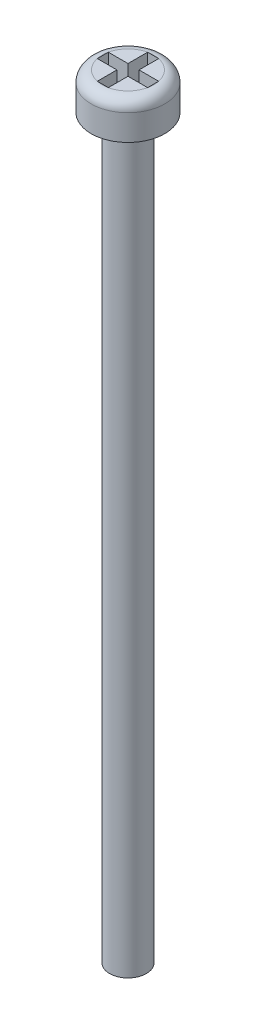
ISO-10303-21;
HEADER;
FILE_DESCRIPTION(('STEP AP214'),'2;1');
FILE_NAME('part.step','',(''),(''),'','','');
FILE_SCHEMA(('AUTOMOTIVE_DESIGN { 1 0 10303 214 1 1 1 1 }'));
ENDSEC;
DATA;
#1=APPLICATION_CONTEXT('core data for automotive mechanical design processes');
#2=APPLICATION_PROTOCOL_DEFINITION('international standard','automotive_design',2000,#1);
#3=PRODUCT_CONTEXT('',#1,'mechanical');
#4=PRODUCT('Part','Part','',(#3));
#5=PRODUCT_RELATED_PRODUCT_CATEGORY('part','',(#4));
#6=PRODUCT_DEFINITION_FORMATION('','',#4);
#7=PRODUCT_DEFINITION_CONTEXT('part definition',#1,'design');
#8=PRODUCT_DEFINITION('design','',#6,#7);
#9=PRODUCT_DEFINITION_SHAPE('','',#8);
#10=(LENGTH_UNIT() NAMED_UNIT(*) SI_UNIT(.MILLI.,.METRE.));
#11=(NAMED_UNIT(*) PLANE_ANGLE_UNIT() SI_UNIT($,.RADIAN.));
#12=(NAMED_UNIT(*) SI_UNIT($,.STERADIAN.) SOLID_ANGLE_UNIT());
#13=UNCERTAINTY_MEASURE_WITH_UNIT(LENGTH_MEASURE(1.E-05),#10,'distance_accuracy_value','');
#14=(GEOMETRIC_REPRESENTATION_CONTEXT(3) GLOBAL_UNCERTAINTY_ASSIGNED_CONTEXT((#13)) GLOBAL_UNIT_ASSIGNED_CONTEXT((#10,
#11,#12)) REPRESENTATION_CONTEXT('',''));
#15=CARTESIAN_POINT('',(0.,0.,0.));
#16=DIRECTION('',(0.,0.,1.));
#17=DIRECTION('',(1.,0.,0.));
#18=AXIS2_PLACEMENT_3D('',#15,#16,#17);
#19=CARTESIAN_POINT('',(0.,10.,0.));
#20=DIRECTION('',(0.,1.,0.));
#21=DIRECTION('',(0.,0.,1.));
#22=AXIS2_PLACEMENT_3D('',#19,#20,#21);
#23=PLANE('',#22);
#24=DIRECTION('',(-1.,0.,0.));
#25=VECTOR('',#24,1.);
#26=CARTESIAN_POINT('',(0.15,10.,-0.15));
#27=LINE('',#26,#25);
#28=CARTESIAN_POINT('',(0.683739716558867,10.,-0.15));
#29=VERTEX_POINT('',#28);
#30=CARTESIAN_POINT('',(0.15,10.,-0.15));
#31=VERTEX_POINT('',#30);
#32=EDGE_CURVE('E47',#29,#31,#27,.T.);
#33=ORIENTED_EDGE('',*,*,#32,.F.);
#34=CARTESIAN_POINT('',(0.,10.,0.));
#35=DIRECTION('',(0.,1.,0.));
#36=DIRECTION('',(0.,0.,1.));
#37=AXIS2_PLACEMENT_3D('',#34,#35,#36);
#38=CIRCLE('',#37,0.7);
#39=CARTESIAN_POINT('',(0.15,10.,-0.683739716558867));
#40=VERTEX_POINT('',#39);
#41=EDGE_CURVE('E219',#29,#40,#38,.T.);
#42=ORIENTED_EDGE('',*,*,#41,.T.);
#43=DIRECTION('',(0.,0.,-1.));
#44=VECTOR('',#43,1.);
#45=CARTESIAN_POINT('',(0.15,10.,-0.15));
#46=LINE('',#45,#44);
#47=EDGE_CURVE('E157',#31,#40,#46,.T.);
#48=ORIENTED_EDGE('',*,*,#47,.F.);
#49=EDGE_LOOP('',(#33,#42,#48));
#50=FACE_BOUND('',#49,.T.);
#51=ADVANCED_FACE('F32',(#50),#23,.T.);
#52=DIRECTION('',(0.,0.,-1.));
#53=VECTOR('',#52,1.);
#54=CARTESIAN_POINT('',(0.683739716558867,10.,0.15));
#55=LINE('',#54,#53);
#56=CARTESIAN_POINT('',(0.683739716558867,10.,0.15));
#57=VERTEX_POINT('',#56);
#58=EDGE_CURVE('E184',#57,#29,#55,.T.);
#59=ORIENTED_EDGE('',*,*,#58,.F.);
#60=EDGE_CURVE('E215',#57,#29,#38,.T.);
#61=ORIENTED_EDGE('',*,*,#60,.T.);
#62=EDGE_LOOP('',(#59,#61));
#63=FACE_BOUND('',#62,.T.);
#64=ADVANCED_FACE('F254',(#63),#23,.T.);
#65=DIRECTION('',(1.,0.,0.));
#66=VECTOR('',#65,1.);
#67=CARTESIAN_POINT('',(0.15,10.,0.15));
#68=LINE('',#67,#66);
#69=CARTESIAN_POINT('',(0.15,10.,0.15));
#70=VERTEX_POINT('',#69);
#71=EDGE_CURVE('E182',#70,#57,#68,.T.);
#72=ORIENTED_EDGE('',*,*,#71,.F.);
#73=DIRECTION('',(0.,0.,-1.));
#74=VECTOR('',#73,1.);
#75=CARTESIAN_POINT('',(0.15,10.,0.683739716558867));
#76=LINE('',#75,#74);
#77=CARTESIAN_POINT('',(0.15,10.,0.683739716558867));
#78=VERTEX_POINT('',#77);
#79=EDGE_CURVE('E131',#78,#70,#76,.T.);
#80=ORIENTED_EDGE('',*,*,#79,.F.);
#81=EDGE_CURVE('E40',#78,#57,#38,.T.);
#82=ORIENTED_EDGE('',*,*,#81,.T.);
#83=EDGE_LOOP('',(#72,#80,#82));
#84=FACE_BOUND('',#83,.T.);
#85=ADVANCED_FACE('F256',(#84),#23,.T.);
#86=DIRECTION('',(1.,0.,0.));
#87=VECTOR('',#86,1.);
#88=CARTESIAN_POINT('',(-0.15,10.,0.683739716558867));
#89=LINE('',#88,#87);
#90=CARTESIAN_POINT('',(-0.15,10.,0.683739716558867));
#91=VERTEX_POINT('',#90);
#92=EDGE_CURVE('E178',#91,#78,#89,.T.);
#93=ORIENTED_EDGE('',*,*,#92,.F.);
#94=EDGE_CURVE('E212',#91,#78,#38,.T.);
#95=ORIENTED_EDGE('',*,*,#94,.T.);
#96=EDGE_LOOP('',(#93,#95));
#97=FACE_BOUND('',#96,.T.);
#98=ADVANCED_FACE('F258',(#97),#23,.T.);
#99=DIRECTION('',(0.,0.,1.));
#100=VECTOR('',#99,1.);
#101=CARTESIAN_POINT('',(-0.15,10.,0.683739716558867));
#102=LINE('',#101,#100);
#103=CARTESIAN_POINT('',(-0.15,10.,0.15));
#104=VERTEX_POINT('',#103);
#105=EDGE_CURVE('E175',#104,#91,#102,.T.);
#106=ORIENTED_EDGE('',*,*,#105,.F.);
#107=DIRECTION('',(1.,0.,0.));
#108=VECTOR('',#107,1.);
#109=CARTESIAN_POINT('',(-0.683739716558867,10.,0.15));
#110=LINE('',#109,#108);
#111=CARTESIAN_POINT('',(-0.683739716558867,10.,0.15));
#112=VERTEX_POINT('',#111);
#113=EDGE_CURVE('E172',#112,#104,#110,.T.);
#114=ORIENTED_EDGE('',*,*,#113,.F.);
#115=EDGE_CURVE('E221',#112,#91,#38,.T.);
#116=ORIENTED_EDGE('',*,*,#115,.T.);
#117=EDGE_LOOP('',(#106,#114,#116));
#118=FACE_BOUND('',#117,.T.);
#119=ADVANCED_FACE('F264',(#118),#23,.T.);
#120=DIRECTION('',(0.,0.,1.));
#121=VECTOR('',#120,1.);
#122=CARTESIAN_POINT('',(-0.683739716558867,10.,0.15));
#123=LINE('',#122,#121);
#124=CARTESIAN_POINT('',(-0.683739716558867,10.,-0.15));
#125=VERTEX_POINT('',#124);
#126=EDGE_CURVE('E169',#125,#112,#123,.T.);
#127=ORIENTED_EDGE('',*,*,#126,.F.);
#128=EDGE_CURVE('E226',#125,#112,#38,.T.);
#129=ORIENTED_EDGE('',*,*,#128,.T.);
#130=EDGE_LOOP('',(#127,#129));
#131=FACE_BOUND('',#130,.T.);
#132=ADVANCED_FACE('F285',(#131),#23,.T.);
#133=DIRECTION('',(-1.,0.,0.));
#134=VECTOR('',#133,1.);
#135=CARTESIAN_POINT('',(-0.683739716558867,10.,-0.15));
#136=LINE('',#135,#134);
#137=CARTESIAN_POINT('',(-0.15,10.,-0.15));
#138=VERTEX_POINT('',#137);
#139=EDGE_CURVE('E166',#138,#125,#136,.T.);
#140=ORIENTED_EDGE('',*,*,#139,.F.);
#141=DIRECTION('',(0.,0.,1.));
#142=VECTOR('',#141,1.);
#143=CARTESIAN_POINT('',(-0.15,10.,-0.15));
#144=LINE('',#143,#142);
#145=CARTESIAN_POINT('',(-0.15,10.,-0.683739716558867));
#146=VERTEX_POINT('',#145);
#147=EDGE_CURVE('E163',#146,#138,#144,.T.);
#148=ORIENTED_EDGE('',*,*,#147,.F.);
#149=EDGE_CURVE('E232',#146,#125,#38,.T.);
#150=ORIENTED_EDGE('',*,*,#149,.T.);
#151=EDGE_LOOP('',(#140,#148,#150));
#152=FACE_BOUND('',#151,.T.);
#153=ADVANCED_FACE('F273',(#152),#23,.T.);
#154=CARTESIAN_POINT('',(0.,-11.,0.));
#155=DIRECTION('',(0.,1.,0.));
#156=DIRECTION('',(0.,0.,1.));
#157=AXIS2_PLACEMENT_3D('',#154,#155,#156);
#158=CYLINDRICAL_SURFACE('',#157,0.5);
#159=CARTESIAN_POINT('',(0.,-11.,0.));
#160=DIRECTION('',(0.,1.,0.));
#161=DIRECTION('',(0.,0.,1.));
#162=AXIS2_PLACEMENT_3D('',#159,#160,#161);
#163=CIRCLE('',#162,0.5);
#164=CARTESIAN_POINT('',(0.,-11.,0.5));
#165=VERTEX_POINT('',#164);
#166=EDGE_CURVE('E209',#165,#165,#163,.T.);
#167=ORIENTED_EDGE('',*,*,#166,.T.);
#168=EDGE_LOOP('',(#167));
#169=FACE_BOUND('',#168,.T.);
#170=CARTESIAN_POINT('',(0.,9.,0.));
#171=DIRECTION('',(0.,1.,0.));
#172=DIRECTION('',(0.,0.,1.));
#173=AXIS2_PLACEMENT_3D('',#170,#171,#172);
#174=CIRCLE('',#173,0.5);
#175=CARTESIAN_POINT('',(0.,9.,0.5));
#176=VERTEX_POINT('',#175);
#177=EDGE_CURVE('E208',#176,#176,#174,.F.);
#178=ORIENTED_EDGE('',*,*,#177,.T.);
#179=EDGE_LOOP('',(#178));
#180=FACE_BOUND('',#179,.T.);
#181=ADVANCED_FACE('F284',(#169,#180),#158,.T.);
#182=CARTESIAN_POINT('',(0.,-11.,0.));
#183=DIRECTION('',(0.,1.,0.));
#184=DIRECTION('',(0.,0.,1.));
#185=AXIS2_PLACEMENT_3D('',#182,#183,#184);
#186=PLANE('',#185);
#187=ORIENTED_EDGE('',*,*,#166,.F.);
#188=EDGE_LOOP('',(#187));
#189=FACE_BOUND('',#188,.T.);
#190=ADVANCED_FACE('F290',(#189),#186,.F.);
#191=CARTESIAN_POINT('',(0.,9.,0.));
#192=DIRECTION('',(0.,1.,0.));
#193=DIRECTION('',(0.,0.,1.));
#194=AXIS2_PLACEMENT_3D('',#191,#192,#193);
#195=CYLINDRICAL_SURFACE('',#194,1.);
#196=CARTESIAN_POINT('',(0.,9.7,0.));
#197=DIRECTION('',(0.,1.,0.));
#198=DIRECTION('',(0.,0.,1.));
#199=AXIS2_PLACEMENT_3D('',#196,#197,#198);
#200=CIRCLE('',#199,1.);
#201=CARTESIAN_POINT('',(0.,9.7,1.));
#202=VERTEX_POINT('',#201);
#203=EDGE_CURVE('E11',#202,#202,#200,.F.);
#204=ORIENTED_EDGE('',*,*,#203,.T.);
#205=EDGE_LOOP('',(#204));
#206=FACE_BOUND('',#205,.T.);
#207=CARTESIAN_POINT('',(0.,9.,0.));
#208=DIRECTION('',(0.,1.,0.));
#209=DIRECTION('',(0.,0.,1.));
#210=AXIS2_PLACEMENT_3D('',#207,#208,#209);
#211=CIRCLE('',#210,1.);
#212=CARTESIAN_POINT('',(0.,9.,1.));
#213=VERTEX_POINT('',#212);
#214=EDGE_CURVE('E188',#213,#213,#211,.T.);
#215=ORIENTED_EDGE('',*,*,#214,.T.);
#216=EDGE_LOOP('',(#215));
#217=FACE_BOUND('',#216,.T.);
#218=ADVANCED_FACE('F280',(#206,#217),#195,.T.);
#219=CARTESIAN_POINT('',(0.,9.,0.));
#220=DIRECTION('',(0.,1.,0.));
#221=DIRECTION('',(0.,0.,1.));
#222=AXIS2_PLACEMENT_3D('',#219,#220,#221);
#223=PLANE('',#222);
#224=ORIENTED_EDGE('',*,*,#177,.F.);
#225=EDGE_LOOP('',(#224));
#226=FACE_BOUND('',#225,.T.);
#227=ORIENTED_EDGE('',*,*,#214,.F.);
#228=EDGE_LOOP('',(#227));
#229=FACE_BOUND('',#228,.T.);
#230=ADVANCED_FACE('F272',(#226,#229),#223,.F.);
#231=DIRECTION('',(-1.,0.,0.));
#232=VECTOR('',#231,1.);
#233=CARTESIAN_POINT('',(-0.15,10.,-0.683739716558867));
#234=LINE('',#233,#232);
#235=EDGE_CURVE('E160',#40,#146,#234,.T.);
#236=ORIENTED_EDGE('',*,*,#235,.F.);
#237=EDGE_CURVE('E237',#40,#146,#38,.T.);
#238=ORIENTED_EDGE('',*,*,#237,.T.);
#239=EDGE_LOOP('',(#236,#238));
#240=FACE_BOUND('',#239,.T.);
#241=ADVANCED_FACE('F265',(#240),#23,.T.);
#242=CARTESIAN_POINT('',(0.,9.7,0.));
#243=DIRECTION('',(0.,1.,0.));
#244=DIRECTION('',(0.,0.,1.));
#245=AXIS2_PLACEMENT_3D('',#242,#243,#244);
#246=TOROIDAL_SURFACE('',#245,0.7,0.3);
#247=ORIENTED_EDGE('',*,*,#203,.F.);
#248=EDGE_LOOP('',(#247));
#249=FACE_BOUND('',#248,.T.);
#250=ORIENTED_EDGE('',*,*,#81,.F.);
#251=ORIENTED_EDGE('',*,*,#94,.F.);
#252=ORIENTED_EDGE('',*,*,#115,.F.);
#253=ORIENTED_EDGE('',*,*,#128,.F.);
#254=ORIENTED_EDGE('',*,*,#149,.F.);
#255=ORIENTED_EDGE('',*,*,#237,.F.);
#256=ORIENTED_EDGE('',*,*,#41,.F.);
#257=ORIENTED_EDGE('',*,*,#60,.F.);
#258=EDGE_LOOP('',(#250,#251,#252,#253,#254,#255,#256,#257));
#259=FACE_BOUND('',#258,.T.);
#260=ADVANCED_FACE('F34',(#249,#259),#246,.T.);
#261=CARTESIAN_POINT('',(0.15,9.4,-0.15));
#262=DIRECTION('',(0.,0.,-1.));
#263=DIRECTION('',(-1.,0.,0.));
#264=AXIS2_PLACEMENT_3D('',#261,#262,#263);
#265=PLANE('',#264);
#266=ORIENTED_EDGE('',*,*,#32,.T.);
#267=DIRECTION('',(0.,1.,0.));
#268=VECTOR('',#267,1.);
#269=CARTESIAN_POINT('',(0.15,9.4,-0.15));
#270=LINE('',#269,#268);
#271=CARTESIAN_POINT('',(0.15,9.4,-0.15));
#272=VERTEX_POINT('',#271);
#273=EDGE_CURVE('E95',#272,#31,#270,.T.);
#274=ORIENTED_EDGE('',*,*,#273,.F.);
#275=DIRECTION('',(-1.,0.,0.));
#276=VECTOR('',#275,1.);
#277=CARTESIAN_POINT('',(0.15,9.4,-0.15));
#278=LINE('',#277,#276);
#279=CARTESIAN_POINT('',(0.683739716558867,9.4,-0.15));
#280=VERTEX_POINT('',#279);
#281=EDGE_CURVE('E186',#280,#272,#278,.T.);
#282=ORIENTED_EDGE('',*,*,#281,.F.);
#283=DIRECTION('',(0.,1.,0.));
#284=VECTOR('',#283,1.);
#285=CARTESIAN_POINT('',(0.683739716558867,9.4,-0.15));
#286=LINE('',#285,#284);
#287=EDGE_CURVE('E55',#280,#29,#286,.T.);
#288=ORIENTED_EDGE('',*,*,#287,.T.);
#289=EDGE_LOOP('',(#266,#274,#282,#288));
#290=FACE_BOUND('',#289,.T.);
#291=ADVANCED_FACE('F278',(#290),#265,.F.);
#292=CARTESIAN_POINT('',(0.683739716558867,9.4,0.15));
#293=DIRECTION('',(1.,0.,0.));
#294=DIRECTION('',(0.,0.,-1.));
#295=AXIS2_PLACEMENT_3D('',#292,#293,#294);
#296=PLANE('',#295);
#297=ORIENTED_EDGE('',*,*,#58,.T.);
#298=ORIENTED_EDGE('',*,*,#287,.F.);
#299=DIRECTION('',(0.,0.,-1.));
#300=VECTOR('',#299,1.);
#301=CARTESIAN_POINT('',(0.683739716558867,9.4,0.15));
#302=LINE('',#301,#300);
#303=CARTESIAN_POINT('',(0.683739716558867,9.4,0.15));
#304=VERTEX_POINT('',#303);
#305=EDGE_CURVE('E143',#304,#280,#302,.T.);
#306=ORIENTED_EDGE('',*,*,#305,.F.);
#307=DIRECTION('',(0.,1.,0.));
#308=VECTOR('',#307,1.);
#309=CARTESIAN_POINT('',(0.683739716558867,9.4,0.15));
#310=LINE('',#309,#308);
#311=EDGE_CURVE('E135',#304,#57,#310,.T.);
#312=ORIENTED_EDGE('',*,*,#311,.T.);
#313=EDGE_LOOP('',(#297,#298,#306,#312));
#314=FACE_BOUND('',#313,.T.);
#315=ADVANCED_FACE('F255',(#314),#296,.F.);
#316=CARTESIAN_POINT('',(0.15,9.4,0.15));
#317=DIRECTION('',(0.,0.,1.));
#318=DIRECTION('',(1.,0.,0.));
#319=AXIS2_PLACEMENT_3D('',#316,#317,#318);
#320=PLANE('',#319);
#321=ORIENTED_EDGE('',*,*,#71,.T.);
#322=ORIENTED_EDGE('',*,*,#311,.F.);
#323=DIRECTION('',(1.,0.,0.));
#324=VECTOR('',#323,1.);
#325=CARTESIAN_POINT('',(0.15,9.4,0.15));
#326=LINE('',#325,#324);
#327=CARTESIAN_POINT('',(0.15,9.4,0.15));
#328=VERTEX_POINT('',#327);
#329=EDGE_CURVE('E139',#328,#304,#326,.T.);
#330=ORIENTED_EDGE('',*,*,#329,.F.);
#331=DIRECTION('',(0.,1.,0.));
#332=VECTOR('',#331,1.);
#333=CARTESIAN_POINT('',(0.15,9.4,0.15));
#334=LINE('',#333,#332);
#335=EDGE_CURVE('E124',#328,#70,#334,.T.);
#336=ORIENTED_EDGE('',*,*,#335,.T.);
#337=EDGE_LOOP('',(#321,#322,#330,#336));
#338=FACE_BOUND('',#337,.T.);
#339=ADVANCED_FACE('F140',(#338),#320,.F.);
#340=CARTESIAN_POINT('',(0.15,9.4,0.683739716558867));
#341=DIRECTION('',(1.,0.,0.));
#342=DIRECTION('',(0.,0.,-1.));
#343=AXIS2_PLACEMENT_3D('',#340,#341,#342);
#344=PLANE('',#343);
#345=ORIENTED_EDGE('',*,*,#79,.T.);
#346=ORIENTED_EDGE('',*,*,#335,.F.);
#347=DIRECTION('',(0.,0.,-1.));
#348=VECTOR('',#347,1.);
#349=CARTESIAN_POINT('',(0.15,9.4,0.683739716558867));
#350=LINE('',#349,#348);
#351=CARTESIAN_POINT('',(0.15,9.4,0.683739716558867));
#352=VERTEX_POINT('',#351);
#353=EDGE_CURVE('E128',#352,#328,#350,.T.);
#354=ORIENTED_EDGE('',*,*,#353,.F.);
#355=DIRECTION('',(0.,1.,0.));
#356=VECTOR('',#355,1.);
#357=CARTESIAN_POINT('',(0.15,9.4,0.683739716558867));
#358=LINE('',#357,#356);
#359=EDGE_CURVE('E136',#352,#78,#358,.T.);
#360=ORIENTED_EDGE('',*,*,#359,.T.);
#361=EDGE_LOOP('',(#345,#346,#354,#360));
#362=FACE_BOUND('',#361,.T.);
#363=ADVANCED_FACE('F126',(#362),#344,.F.);
#364=CARTESIAN_POINT('',(-0.15,9.4,0.683739716558867));
#365=DIRECTION('',(0.,0.,1.));
#366=DIRECTION('',(1.,0.,0.));
#367=AXIS2_PLACEMENT_3D('',#364,#365,#366);
#368=PLANE('',#367);
#369=ORIENTED_EDGE('',*,*,#92,.T.);
#370=ORIENTED_EDGE('',*,*,#359,.F.);
#371=DIRECTION('',(1.,0.,0.));
#372=VECTOR('',#371,1.);
#373=CARTESIAN_POINT('',(-0.15,9.4,0.683739716558867));
#374=LINE('',#373,#372);
#375=CARTESIAN_POINT('',(-0.15,9.4,0.683739716558867));
#376=VERTEX_POINT('',#375);
#377=EDGE_CURVE('E149',#376,#352,#374,.T.);
#378=ORIENTED_EDGE('',*,*,#377,.F.);
#379=DIRECTION('',(0.,1.,0.));
#380=VECTOR('',#379,1.);
#381=CARTESIAN_POINT('',(-0.15,9.4,0.683739716558867));
#382=LINE('',#381,#380);
#383=EDGE_CURVE('E191',#376,#91,#382,.T.);
#384=ORIENTED_EDGE('',*,*,#383,.T.);
#385=EDGE_LOOP('',(#369,#370,#378,#384));
#386=FACE_BOUND('',#385,.T.);
#387=ADVANCED_FACE('F317',(#386),#368,.F.);
#388=CARTESIAN_POINT('',(-0.15,9.4,0.683739716558867));
#389=DIRECTION('',(-1.,0.,0.));
#390=DIRECTION('',(0.,0.,1.));
#391=AXIS2_PLACEMENT_3D('',#388,#389,#390);
#392=PLANE('',#391);
#393=ORIENTED_EDGE('',*,*,#105,.T.);
#394=ORIENTED_EDGE('',*,*,#383,.F.);
#395=DIRECTION('',(0.,0.,1.));
#396=VECTOR('',#395,1.);
#397=CARTESIAN_POINT('',(-0.15,9.4,0.683739716558867));
#398=LINE('',#397,#396);
#399=CARTESIAN_POINT('',(-0.15,9.4,0.15));
#400=VERTEX_POINT('',#399);
#401=EDGE_CURVE('E151',#400,#376,#398,.T.);
#402=ORIENTED_EDGE('',*,*,#401,.F.);
#403=DIRECTION('',(0.,1.,0.));
#404=VECTOR('',#403,1.);
#405=CARTESIAN_POINT('',(-0.15,9.4,0.15));
#406=LINE('',#405,#404);
#407=EDGE_CURVE('E193',#400,#104,#406,.T.);
#408=ORIENTED_EDGE('',*,*,#407,.T.);
#409=EDGE_LOOP('',(#393,#394,#402,#408));
#410=FACE_BOUND('',#409,.T.);
#411=ADVANCED_FACE('F315',(#410),#392,.F.);
#412=CARTESIAN_POINT('',(-0.683739716558867,9.4,0.15));
#413=DIRECTION('',(0.,0.,1.));
#414=DIRECTION('',(1.,0.,0.));
#415=AXIS2_PLACEMENT_3D('',#412,#413,#414);
#416=PLANE('',#415);
#417=ORIENTED_EDGE('',*,*,#113,.T.);
#418=ORIENTED_EDGE('',*,*,#407,.F.);
#419=DIRECTION('',(1.,0.,0.));
#420=VECTOR('',#419,1.);
#421=CARTESIAN_POINT('',(-0.683739716558867,9.4,0.15));
#422=LINE('',#421,#420);
#423=CARTESIAN_POINT('',(-0.683739716558867,9.4,0.15));
#424=VERTEX_POINT('',#423);
#425=EDGE_CURVE('E303',#424,#400,#422,.T.);
#426=ORIENTED_EDGE('',*,*,#425,.F.);
#427=DIRECTION('',(0.,1.,0.));
#428=VECTOR('',#427,1.);
#429=CARTESIAN_POINT('',(-0.683739716558867,9.4,0.15));
#430=LINE('',#429,#428);
#431=EDGE_CURVE('E195',#424,#112,#430,.T.);
#432=ORIENTED_EDGE('',*,*,#431,.T.);
#433=EDGE_LOOP('',(#417,#418,#426,#432));
#434=FACE_BOUND('',#433,.T.);
#435=ADVANCED_FACE('F300',(#434),#416,.F.);
#436=CARTESIAN_POINT('',(-0.683739716558867,9.4,0.15));
#437=DIRECTION('',(-1.,0.,0.));
#438=DIRECTION('',(0.,0.,1.));
#439=AXIS2_PLACEMENT_3D('',#436,#437,#438);
#440=PLANE('',#439);
#441=ORIENTED_EDGE('',*,*,#126,.T.);
#442=ORIENTED_EDGE('',*,*,#431,.F.);
#443=DIRECTION('',(0.,0.,1.));
#444=VECTOR('',#443,1.);
#445=CARTESIAN_POINT('',(-0.683739716558867,9.4,0.15));
#446=LINE('',#445,#444);
#447=CARTESIAN_POINT('',(-0.683739716558867,9.4,-0.15));
#448=VERTEX_POINT('',#447);
#449=EDGE_CURVE('E305',#448,#424,#446,.T.);
#450=ORIENTED_EDGE('',*,*,#449,.F.);
#451=DIRECTION('',(0.,1.,0.));
#452=VECTOR('',#451,1.);
#453=CARTESIAN_POINT('',(-0.683739716558867,9.4,-0.15));
#454=LINE('',#453,#452);
#455=EDGE_CURVE('E197',#448,#125,#454,.T.);
#456=ORIENTED_EDGE('',*,*,#455,.T.);
#457=EDGE_LOOP('',(#441,#442,#450,#456));
#458=FACE_BOUND('',#457,.T.);
#459=ADVANCED_FACE('F297',(#458),#440,.F.);
#460=CARTESIAN_POINT('',(-0.683739716558867,9.4,-0.15));
#461=DIRECTION('',(0.,0.,-1.));
#462=DIRECTION('',(-1.,0.,0.));
#463=AXIS2_PLACEMENT_3D('',#460,#461,#462);
#464=PLANE('',#463);
#465=ORIENTED_EDGE('',*,*,#139,.T.);
#466=ORIENTED_EDGE('',*,*,#455,.F.);
#467=DIRECTION('',(-1.,0.,0.));
#468=VECTOR('',#467,1.);
#469=CARTESIAN_POINT('',(-0.683739716558867,9.4,-0.15));
#470=LINE('',#469,#468);
#471=CARTESIAN_POINT('',(-0.15,9.4,-0.15));
#472=VERTEX_POINT('',#471);
#473=EDGE_CURVE('E309',#472,#448,#470,.T.);
#474=ORIENTED_EDGE('',*,*,#473,.F.);
#475=DIRECTION('',(0.,1.,0.));
#476=VECTOR('',#475,1.);
#477=CARTESIAN_POINT('',(-0.15,9.4,-0.15));
#478=LINE('',#477,#476);
#479=EDGE_CURVE('E199',#472,#138,#478,.T.);
#480=ORIENTED_EDGE('',*,*,#479,.T.);
#481=EDGE_LOOP('',(#465,#466,#474,#480));
#482=FACE_BOUND('',#481,.T.);
#483=ADVANCED_FACE('F293',(#482),#464,.F.);
#484=CARTESIAN_POINT('',(-0.15,9.4,-0.15));
#485=DIRECTION('',(-1.,0.,0.));
#486=DIRECTION('',(0.,0.,1.));
#487=AXIS2_PLACEMENT_3D('',#484,#485,#486);
#488=PLANE('',#487);
#489=ORIENTED_EDGE('',*,*,#147,.T.);
#490=ORIENTED_EDGE('',*,*,#479,.F.);
#491=DIRECTION('',(0.,0.,1.));
#492=VECTOR('',#491,1.);
#493=CARTESIAN_POINT('',(-0.15,9.4,-0.15));
#494=LINE('',#493,#492);
#495=CARTESIAN_POINT('',(-0.15,9.4,-0.683739716558867));
#496=VERTEX_POINT('',#495);
#497=EDGE_CURVE('E311',#496,#472,#494,.T.);
#498=ORIENTED_EDGE('',*,*,#497,.F.);
#499=DIRECTION('',(0.,1.,0.));
#500=VECTOR('',#499,1.);
#501=CARTESIAN_POINT('',(-0.15,9.4,-0.683739716558867));
#502=LINE('',#501,#500);
#503=EDGE_CURVE('E201',#496,#146,#502,.T.);
#504=ORIENTED_EDGE('',*,*,#503,.T.);
#505=EDGE_LOOP('',(#489,#490,#498,#504));
#506=FACE_BOUND('',#505,.T.);
#507=ADVANCED_FACE('F334',(#506),#488,.F.);
#508=CARTESIAN_POINT('',(-0.15,9.4,-0.683739716558867));
#509=DIRECTION('',(0.,0.,-1.));
#510=DIRECTION('',(-1.,0.,0.));
#511=AXIS2_PLACEMENT_3D('',#508,#509,#510);
#512=PLANE('',#511);
#513=ORIENTED_EDGE('',*,*,#235,.T.);
#514=ORIENTED_EDGE('',*,*,#503,.F.);
#515=DIRECTION('',(-1.,0.,0.));
#516=VECTOR('',#515,1.);
#517=CARTESIAN_POINT('',(-0.15,9.4,-0.683739716558867));
#518=LINE('',#517,#516);
#519=CARTESIAN_POINT('',(0.15,9.4,-0.683739716558867));
#520=VERTEX_POINT('',#519);
#521=EDGE_CURVE('E537',#520,#496,#518,.T.);
#522=ORIENTED_EDGE('',*,*,#521,.F.);
#523=DIRECTION('',(0.,1.,0.));
#524=VECTOR('',#523,1.);
#525=CARTESIAN_POINT('',(0.15,9.4,-0.683739716558867));
#526=LINE('',#525,#524);
#527=EDGE_CURVE('E203',#520,#40,#526,.T.);
#528=ORIENTED_EDGE('',*,*,#527,.T.);
#529=EDGE_LOOP('',(#513,#514,#522,#528));
#530=FACE_BOUND('',#529,.T.);
#531=ADVANCED_FACE('F337',(#530),#512,.F.);
#532=CARTESIAN_POINT('',(0.15,9.4,-0.15));
#533=DIRECTION('',(1.,0.,0.));
#534=DIRECTION('',(0.,0.,-1.));
#535=AXIS2_PLACEMENT_3D('',#532,#533,#534);
#536=PLANE('',#535);
#537=ORIENTED_EDGE('',*,*,#47,.T.);
#538=ORIENTED_EDGE('',*,*,#527,.F.);
#539=DIRECTION('',(0.,0.,-1.));
#540=VECTOR('',#539,1.);
#541=CARTESIAN_POINT('',(0.15,9.4,-0.15));
#542=LINE('',#541,#540);
#543=EDGE_CURVE('E539',#272,#520,#542,.T.);
#544=ORIENTED_EDGE('',*,*,#543,.F.);
#545=ORIENTED_EDGE('',*,*,#273,.T.);
#546=EDGE_LOOP('',(#537,#538,#544,#545));
#547=FACE_BOUND('',#546,.T.);
#548=ADVANCED_FACE('F341',(#547),#536,.F.);
#549=CARTESIAN_POINT('',(0.,9.4,0.));
#550=DIRECTION('',(0.,1.,0.));
#551=DIRECTION('',(0.,0.,1.));
#552=AXIS2_PLACEMENT_3D('',#549,#550,#551);
#553=PLANE('',#552);
#554=ORIENTED_EDGE('',*,*,#281,.T.);
#555=ORIENTED_EDGE('',*,*,#543,.T.);
#556=ORIENTED_EDGE('',*,*,#521,.T.);
#557=ORIENTED_EDGE('',*,*,#497,.T.);
#558=ORIENTED_EDGE('',*,*,#473,.T.);
#559=ORIENTED_EDGE('',*,*,#449,.T.);
#560=ORIENTED_EDGE('',*,*,#425,.T.);
#561=ORIENTED_EDGE('',*,*,#401,.T.);
#562=ORIENTED_EDGE('',*,*,#377,.T.);
#563=ORIENTED_EDGE('',*,*,#353,.T.);
#564=ORIENTED_EDGE('',*,*,#329,.T.);
#565=ORIENTED_EDGE('',*,*,#305,.T.);
#566=EDGE_LOOP('',(#554,#555,#556,#557,#558,#559,#560,#561,#562,#563,#564,#565));
#567=FACE_BOUND('',#566,.T.);
#568=ADVANCED_FACE('F146',(#567),#553,.T.);
#569=CLOSED_SHELL('',(#51,#64,#85,#98,#119,#132,#153,#181,#190,#218,#230,#241,#260,#291,#315,
#339,#363,#387,#411,#435,#459,#483,#507,#531,#548,#568));
#570=MANIFOLD_SOLID_BREP('B2',#569);
#571=ADVANCED_BREP_SHAPE_REPRESENTATION('',(#18,#570),#14);
#572=SHAPE_DEFINITION_REPRESENTATION(#9,#571);
ENDSEC;
END-ISO-10303-21;
